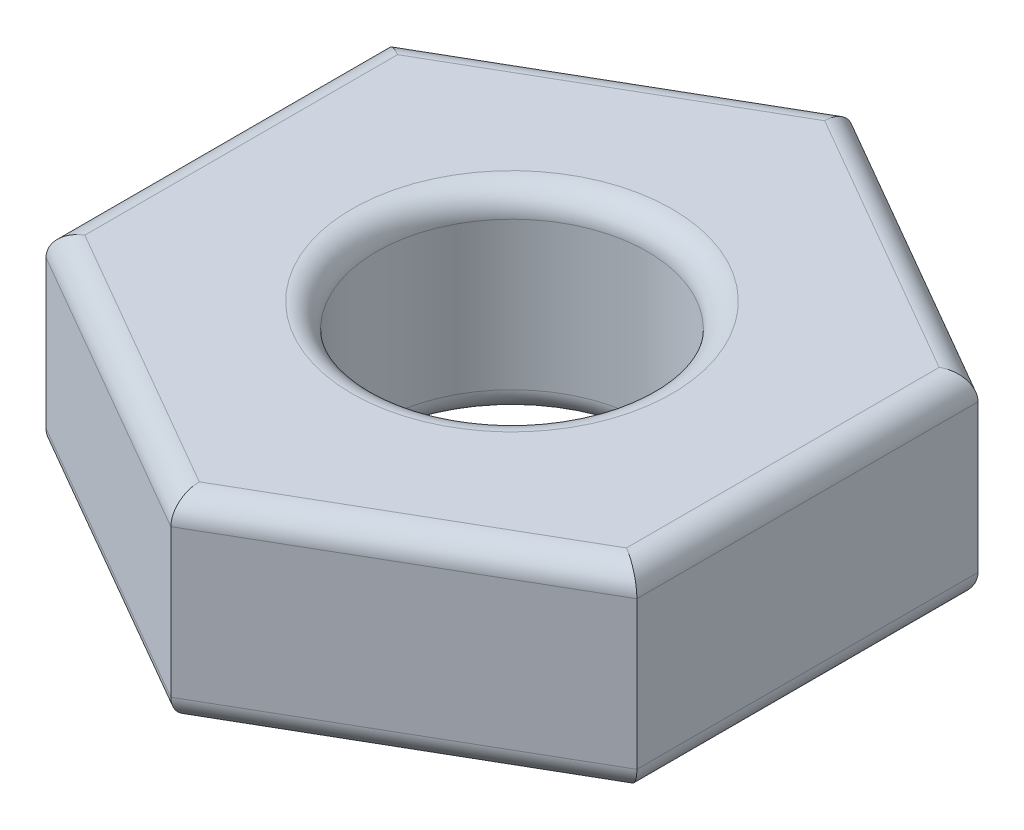
ISO-10303-21;
HEADER;
FILE_DESCRIPTION(('STEP AP214'),'2;1');
FILE_NAME('part.step','',(''),(''),'','','');
FILE_SCHEMA(('AUTOMOTIVE_DESIGN { 1 0 10303 214 1 1 1 1 }'));
ENDSEC;
DATA;
#1=APPLICATION_CONTEXT('core data for automotive mechanical design processes');
#2=APPLICATION_PROTOCOL_DEFINITION('international standard','automotive_design',2000,#1);
#3=PRODUCT_CONTEXT('',#1,'mechanical');
#4=PRODUCT('Part','Part','',(#3));
#5=PRODUCT_RELATED_PRODUCT_CATEGORY('part','',(#4));
#6=PRODUCT_DEFINITION_FORMATION('','',#4);
#7=PRODUCT_DEFINITION_CONTEXT('part definition',#1,'design');
#8=PRODUCT_DEFINITION('design','',#6,#7);
#9=PRODUCT_DEFINITION_SHAPE('','',#8);
#10=(LENGTH_UNIT() NAMED_UNIT(*) SI_UNIT(.MILLI.,.METRE.));
#11=(NAMED_UNIT(*) PLANE_ANGLE_UNIT() SI_UNIT($,.RADIAN.));
#12=(NAMED_UNIT(*) SI_UNIT($,.STERADIAN.) SOLID_ANGLE_UNIT());
#13=UNCERTAINTY_MEASURE_WITH_UNIT(LENGTH_MEASURE(1.E-05),#10,'distance_accuracy_value','');
#14=(GEOMETRIC_REPRESENTATION_CONTEXT(3) GLOBAL_UNCERTAINTY_ASSIGNED_CONTEXT((#13)) GLOBAL_UNIT_ASSIGNED_CONTEXT((#10,
#11,#12)) REPRESENTATION_CONTEXT('',''));
#15=CARTESIAN_POINT('',(0.,0.,0.));
#16=DIRECTION('',(0.,0.,1.));
#17=DIRECTION('',(1.,0.,0.));
#18=AXIS2_PLACEMENT_3D('',#15,#16,#17);
#19=CARTESIAN_POINT('',(2.4,1.6,1.3856406460551));
#20=DIRECTION('',(-1.,0.,0.));
#21=DIRECTION('',(0.,0.,1.));
#22=AXIS2_PLACEMENT_3D('',#19,#20,#21);
#23=PLANE('',#22);
#24=DIRECTION('',(0.,-1.,0.));
#25=VECTOR('',#24,1.);
#26=CARTESIAN_POINT('',(2.4,1.6,1.3856406460551));
#27=LINE('',#26,#25);
#28=CARTESIAN_POINT('',(2.4,1.4,1.3856406460551));
#29=VERTEX_POINT('',#28);
#30=CARTESIAN_POINT('',(2.4,0.2,1.3856406460551));
#31=VERTEX_POINT('',#30);
#32=EDGE_CURVE('E233',#29,#31,#27,.T.);
#33=ORIENTED_EDGE('',*,*,#32,.T.);
#34=DIRECTION('',(0.,0.,-1.));
#35=VECTOR('',#34,1.);
#36=CARTESIAN_POINT('',(2.4,0.2,1.3856406460551));
#37=LINE('',#36,#35);
#38=CARTESIAN_POINT('',(2.4,0.2,-1.3856406460551));
#39=VERTEX_POINT('',#38);
#40=EDGE_CURVE('E199',#31,#39,#37,.T.);
#41=ORIENTED_EDGE('',*,*,#40,.T.);
#42=DIRECTION('',(0.,-1.,0.));
#43=VECTOR('',#42,1.);
#44=CARTESIAN_POINT('',(2.4,1.6,-1.3856406460551));
#45=LINE('',#44,#43);
#46=CARTESIAN_POINT('',(2.4,1.4,-1.3856406460551));
#47=VERTEX_POINT('',#46);
#48=EDGE_CURVE('E149',#47,#39,#45,.T.);
#49=ORIENTED_EDGE('',*,*,#48,.F.);
#50=DIRECTION('',(0.,0.,-1.));
#51=VECTOR('',#50,1.);
#52=CARTESIAN_POINT('',(2.4,1.4,1.3856406460551));
#53=LINE('',#52,#51);
#54=EDGE_CURVE('E197',#47,#29,#53,.F.);
#55=ORIENTED_EDGE('',*,*,#54,.T.);
#56=EDGE_LOOP('',(#33,#41,#49,#55));
#57=FACE_BOUND('',#56,.T.);
#58=ADVANCED_FACE('F37',(#57),#23,.F.);
#59=CARTESIAN_POINT('',(2.4,1.6,-1.3856406460551));
#60=DIRECTION('',(-0.5,0.,0.866025403784439));
#61=DIRECTION('',(0.866025403784439,0.,0.5));
#62=AXIS2_PLACEMENT_3D('',#59,#60,#61);
#63=PLANE('',#62);
#64=ORIENTED_EDGE('',*,*,#48,.T.);
#65=DIRECTION('',(-0.866025403784439,0.,-0.5));
#66=VECTOR('',#65,1.);
#67=CARTESIAN_POINT('',(2.4,0.2,-1.3856406460551));
#68=LINE('',#67,#66);
#69=CARTESIAN_POINT('',(0.,0.2,-2.7712812921102));
#70=VERTEX_POINT('',#69);
#71=EDGE_CURVE('E148',#39,#70,#68,.T.);
#72=ORIENTED_EDGE('',*,*,#71,.T.);
#73=DIRECTION('',(0.,-1.,0.));
#74=VECTOR('',#73,1.);
#75=CARTESIAN_POINT('',(0.,1.6,-2.7712812921102));
#76=LINE('',#75,#74);
#77=CARTESIAN_POINT('',(0.,1.4,-2.7712812921102));
#78=VERTEX_POINT('',#77);
#79=EDGE_CURVE('E130',#78,#70,#76,.T.);
#80=ORIENTED_EDGE('',*,*,#79,.F.);
#81=DIRECTION('',(-0.866025403784439,0.,-0.5));
#82=VECTOR('',#81,1.);
#83=CARTESIAN_POINT('',(2.4,1.4,-1.3856406460551));
#84=LINE('',#83,#82);
#85=EDGE_CURVE('E145',#78,#47,#84,.F.);
#86=ORIENTED_EDGE('',*,*,#85,.T.);
#87=EDGE_LOOP('',(#64,#72,#80,#86));
#88=FACE_BOUND('',#87,.T.);
#89=ADVANCED_FACE('F143',(#88),#63,.F.);
#90=CARTESIAN_POINT('',(0.,1.6,-2.7712812921102));
#91=DIRECTION('',(0.5,0.,0.866025403784438));
#92=DIRECTION('',(0.866025403784439,0.,-0.5));
#93=AXIS2_PLACEMENT_3D('',#90,#91,#92);
#94=PLANE('',#93);
#95=ORIENTED_EDGE('',*,*,#79,.T.);
#96=DIRECTION('',(-0.866025403784439,0.,0.5));
#97=VECTOR('',#96,1.);
#98=CARTESIAN_POINT('',(0.,0.2,-2.7712812921102));
#99=LINE('',#98,#97);
#100=CARTESIAN_POINT('',(-2.4,0.2,-1.3856406460551));
#101=VERTEX_POINT('',#100);
#102=EDGE_CURVE('E137',#70,#101,#99,.T.);
#103=ORIENTED_EDGE('',*,*,#102,.T.);
#104=DIRECTION('',(0.,-1.,0.));
#105=VECTOR('',#104,1.);
#106=CARTESIAN_POINT('',(-2.4,1.6,-1.3856406460551));
#107=LINE('',#106,#105);
#108=CARTESIAN_POINT('',(-2.4,1.4,-1.3856406460551));
#109=VERTEX_POINT('',#108);
#110=EDGE_CURVE('E132',#109,#101,#107,.T.);
#111=ORIENTED_EDGE('',*,*,#110,.F.);
#112=DIRECTION('',(-0.866025403784439,0.,0.5));
#113=VECTOR('',#112,1.);
#114=CARTESIAN_POINT('',(0.,1.4,-2.7712812921102));
#115=LINE('',#114,#113);
#116=EDGE_CURVE('E127',#109,#78,#115,.F.);
#117=ORIENTED_EDGE('',*,*,#116,.T.);
#118=EDGE_LOOP('',(#95,#103,#111,#117));
#119=FACE_BOUND('',#118,.T.);
#120=ADVANCED_FACE('F129',(#119),#94,.F.);
#121=CARTESIAN_POINT('',(-2.4,1.6,-1.3856406460551));
#122=DIRECTION('',(1.,0.,0.));
#123=DIRECTION('',(0.,0.,-1.));
#124=AXIS2_PLACEMENT_3D('',#121,#122,#123);
#125=PLANE('',#124);
#126=ORIENTED_EDGE('',*,*,#110,.T.);
#127=DIRECTION('',(0.,0.,1.));
#128=VECTOR('',#127,1.);
#129=CARTESIAN_POINT('',(-2.4,0.2,-1.3856406460551));
#130=LINE('',#129,#128);
#131=CARTESIAN_POINT('',(-2.4,0.2,1.3856406460551));
#132=VERTEX_POINT('',#131);
#133=EDGE_CURVE('E186',#101,#132,#130,.T.);
#134=ORIENTED_EDGE('',*,*,#133,.T.);
#135=DIRECTION('',(0.,-1.,0.));
#136=VECTOR('',#135,1.);
#137=CARTESIAN_POINT('',(-2.4,1.6,1.3856406460551));
#138=LINE('',#137,#136);
#139=CARTESIAN_POINT('',(-2.4,1.4,1.3856406460551));
#140=VERTEX_POINT('',#139);
#141=EDGE_CURVE('E251',#140,#132,#138,.T.);
#142=ORIENTED_EDGE('',*,*,#141,.F.);
#143=DIRECTION('',(0.,0.,1.));
#144=VECTOR('',#143,1.);
#145=CARTESIAN_POINT('',(-2.4,1.4,-1.3856406460551));
#146=LINE('',#145,#144);
#147=EDGE_CURVE('E184',#140,#109,#146,.F.);
#148=ORIENTED_EDGE('',*,*,#147,.T.);
#149=EDGE_LOOP('',(#126,#134,#142,#148));
#150=FACE_BOUND('',#149,.T.);
#151=ADVANCED_FACE('F248',(#150),#125,.F.);
#152=CARTESIAN_POINT('',(-2.4,1.6,1.3856406460551));
#153=DIRECTION('',(0.5,0.,-0.866025403784439));
#154=DIRECTION('',(-0.866025403784439,0.,-0.5));
#155=AXIS2_PLACEMENT_3D('',#152,#153,#154);
#156=PLANE('',#155);
#157=ORIENTED_EDGE('',*,*,#141,.T.);
#158=DIRECTION('',(0.866025403784439,0.,0.5));
#159=VECTOR('',#158,1.);
#160=CARTESIAN_POINT('',(-2.4,0.2,1.3856406460551));
#161=LINE('',#160,#159);
#162=CARTESIAN_POINT('',(0.,0.2,2.7712812921102));
#163=VERTEX_POINT('',#162);
#164=EDGE_CURVE('E190',#132,#163,#161,.T.);
#165=ORIENTED_EDGE('',*,*,#164,.T.);
#166=DIRECTION('',(0.,-1.,0.));
#167=VECTOR('',#166,1.);
#168=CARTESIAN_POINT('',(0.,1.6,2.7712812921102));
#169=LINE('',#168,#167);
#170=CARTESIAN_POINT('',(0.,1.4,2.7712812921102));
#171=VERTEX_POINT('',#170);
#172=EDGE_CURVE('E254',#171,#163,#169,.T.);
#173=ORIENTED_EDGE('',*,*,#172,.F.);
#174=DIRECTION('',(0.866025403784439,0.,0.5));
#175=VECTOR('',#174,1.);
#176=CARTESIAN_POINT('',(-2.4,1.4,1.3856406460551));
#177=LINE('',#176,#175);
#178=EDGE_CURVE('E188',#171,#140,#177,.F.);
#179=ORIENTED_EDGE('',*,*,#178,.T.);
#180=EDGE_LOOP('',(#157,#165,#173,#179));
#181=FACE_BOUND('',#180,.T.);
#182=ADVANCED_FACE('F293',(#181),#156,.F.);
#183=CARTESIAN_POINT('',(0.,1.6,2.7712812921102));
#184=DIRECTION('',(-0.5,0.,-0.866025403784438));
#185=DIRECTION('',(-0.866025403784439,0.,0.5));
#186=AXIS2_PLACEMENT_3D('',#183,#184,#185);
#187=PLANE('',#186);
#188=ORIENTED_EDGE('',*,*,#172,.T.);
#189=DIRECTION('',(0.866025403784439,0.,-0.5));
#190=VECTOR('',#189,1.);
#191=CARTESIAN_POINT('',(0.,0.2,2.7712812921102));
#192=LINE('',#191,#190);
#193=EDGE_CURVE('E195',#163,#31,#192,.T.);
#194=ORIENTED_EDGE('',*,*,#193,.T.);
#195=ORIENTED_EDGE('',*,*,#32,.F.);
#196=DIRECTION('',(0.866025403784439,0.,-0.5));
#197=VECTOR('',#196,1.);
#198=CARTESIAN_POINT('',(0.,1.4,2.7712812921102));
#199=LINE('',#198,#197);
#200=EDGE_CURVE('E192',#29,#171,#199,.F.);
#201=ORIENTED_EDGE('',*,*,#200,.T.);
#202=EDGE_LOOP('',(#188,#194,#195,#201));
#203=FACE_BOUND('',#202,.T.);
#204=ADVANCED_FACE('F294',(#203),#187,.F.);
#205=CARTESIAN_POINT('',(0.,1.6,0.));
#206=DIRECTION('',(0.,1.,0.));
#207=DIRECTION('',(0.,0.,1.));
#208=AXIS2_PLACEMENT_3D('',#205,#206,#207);
#209=PLANE('',#208);
#210=DIRECTION('',(0.866025403784439,0.,0.5));
#211=VECTOR('',#210,1.);
#212=CARTESIAN_POINT('',(0.0999999999999996,1.6,2.59807621135332));
#213=LINE('',#212,#211);
#214=CARTESIAN_POINT('',(-2.2,1.6,1.27017059221718));
#215=VERTEX_POINT('',#214);
#216=CARTESIAN_POINT('',(0.,1.6,2.54034118443435));
#217=VERTEX_POINT('',#216);
#218=EDGE_CURVE('E46',#215,#217,#213,.T.);
#219=ORIENTED_EDGE('',*,*,#218,.T.);
#220=DIRECTION('',(0.866025403784439,0.,-0.5));
#221=VECTOR('',#220,1.);
#222=CARTESIAN_POINT('',(2.3,1.6,1.21243556529821));
#223=LINE('',#222,#221);
#224=CARTESIAN_POINT('',(2.2,1.6,1.27017059221718));
#225=VERTEX_POINT('',#224);
#226=EDGE_CURVE('E11',#217,#225,#223,.T.);
#227=ORIENTED_EDGE('',*,*,#226,.T.);
#228=DIRECTION('',(0.,0.,-1.));
#229=VECTOR('',#228,1.);
#230=CARTESIAN_POINT('',(2.2,1.6,-1.3856406460551));
#231=LINE('',#230,#229);
#232=CARTESIAN_POINT('',(2.2,1.6,-1.27017059221718));
#233=VERTEX_POINT('',#232);
#234=EDGE_CURVE('E210',#225,#233,#231,.T.);
#235=ORIENTED_EDGE('',*,*,#234,.T.);
#236=DIRECTION('',(-0.866025403784439,0.,-0.5));
#237=VECTOR('',#236,1.);
#238=CARTESIAN_POINT('',(-0.0999999999999996,1.6,-2.59807621135331));
#239=LINE('',#238,#237);
#240=CARTESIAN_POINT('',(0.,1.6,-2.54034118443435));
#241=VERTEX_POINT('',#240);
#242=EDGE_CURVE('E212',#233,#241,#239,.T.);
#243=ORIENTED_EDGE('',*,*,#242,.T.);
#244=DIRECTION('',(-0.866025403784439,0.,0.5));
#245=VECTOR('',#244,1.);
#246=CARTESIAN_POINT('',(-2.3,1.6,-1.21243556529821));
#247=LINE('',#246,#245);
#248=CARTESIAN_POINT('',(-2.2,1.6,-1.27017059221718));
#249=VERTEX_POINT('',#248);
#250=EDGE_CURVE('E155',#241,#249,#247,.T.);
#251=ORIENTED_EDGE('',*,*,#250,.T.);
#252=DIRECTION('',(0.,0.,1.));
#253=VECTOR('',#252,1.);
#254=CARTESIAN_POINT('',(-2.2,1.6,1.3856406460551));
#255=LINE('',#254,#253);
#256=EDGE_CURVE('E57',#249,#215,#255,.T.);
#257=ORIENTED_EDGE('',*,*,#256,.T.);
#258=EDGE_LOOP('',(#219,#227,#235,#243,#251,#257));
#259=FACE_BOUND('',#258,.T.);
#260=CARTESIAN_POINT('',(0.,1.6,0.));
#261=DIRECTION('',(0.,1.,0.));
#262=DIRECTION('',(0.,0.,1.));
#263=AXIS2_PLACEMENT_3D('',#260,#261,#262);
#264=CIRCLE('',#263,1.3);
#265=CARTESIAN_POINT('',(0.,1.6,1.3));
#266=VERTEX_POINT('',#265);
#267=EDGE_CURVE('E207',#266,#266,#264,.F.);
#268=ORIENTED_EDGE('',*,*,#267,.T.);
#269=EDGE_LOOP('',(#268));
#270=FACE_BOUND('',#269,.T.);
#271=ADVANCED_FACE('F302',(#259,#270),#209,.T.);
#272=CARTESIAN_POINT('',(0.,0.,0.));
#273=DIRECTION('',(0.,1.,0.));
#274=DIRECTION('',(0.,0.,1.));
#275=AXIS2_PLACEMENT_3D('',#272,#273,#274);
#276=PLANE('',#275);
#277=DIRECTION('',(-0.866025403784439,0.,0.5));
#278=VECTOR('',#277,1.);
#279=CARTESIAN_POINT('',(-1.1,0.,-1.90525588832576));
#280=LINE('',#279,#278);
#281=CARTESIAN_POINT('',(-2.2,0.,-1.27017059221718));
#282=VERTEX_POINT('',#281);
#283=CARTESIAN_POINT('',(0.,0.,-2.54034118443435));
#284=VERTEX_POINT('',#283);
#285=EDGE_CURVE('E179',#282,#284,#280,.F.);
#286=ORIENTED_EDGE('',*,*,#285,.T.);
#287=DIRECTION('',(-0.866025403784439,0.,-0.5));
#288=VECTOR('',#287,1.);
#289=CARTESIAN_POINT('',(1.1,0.,-1.90525588832576));
#290=LINE('',#289,#288);
#291=CARTESIAN_POINT('',(2.2,0.,-1.27017059221718));
#292=VERTEX_POINT('',#291);
#293=EDGE_CURVE('E138',#284,#292,#290,.F.);
#294=ORIENTED_EDGE('',*,*,#293,.T.);
#295=DIRECTION('',(0.,0.,-1.));
#296=VECTOR('',#295,1.);
#297=CARTESIAN_POINT('',(2.2,0.,0.));
#298=LINE('',#297,#296);
#299=CARTESIAN_POINT('',(2.2,0.,1.27017059221718));
#300=VERTEX_POINT('',#299);
#301=EDGE_CURVE('E171',#292,#300,#298,.F.);
#302=ORIENTED_EDGE('',*,*,#301,.T.);
#303=DIRECTION('',(0.866025403784439,0.,-0.5));
#304=VECTOR('',#303,1.);
#305=CARTESIAN_POINT('',(1.1,0.,1.90525588832576));
#306=LINE('',#305,#304);
#307=CARTESIAN_POINT('',(0.,0.,2.54034118443435));
#308=VERTEX_POINT('',#307);
#309=EDGE_CURVE('E173',#300,#308,#306,.F.);
#310=ORIENTED_EDGE('',*,*,#309,.T.);
#311=DIRECTION('',(0.866025403784439,0.,0.5));
#312=VECTOR('',#311,1.);
#313=CARTESIAN_POINT('',(-1.1,0.,1.90525588832576));
#314=LINE('',#313,#312);
#315=CARTESIAN_POINT('',(-2.2,0.,1.27017059221718));
#316=VERTEX_POINT('',#315);
#317=EDGE_CURVE('E175',#308,#316,#314,.F.);
#318=ORIENTED_EDGE('',*,*,#317,.T.);
#319=DIRECTION('',(0.,0.,1.));
#320=VECTOR('',#319,1.);
#321=CARTESIAN_POINT('',(-2.2,0.,0.));
#322=LINE('',#321,#320);
#323=EDGE_CURVE('E177',#316,#282,#322,.F.);
#324=ORIENTED_EDGE('',*,*,#323,.T.);
#325=EDGE_LOOP('',(#286,#294,#302,#310,#318,#324));
#326=FACE_BOUND('',#325,.T.);
#327=CARTESIAN_POINT('',(0.,0.,0.));
#328=DIRECTION('',(0.,1.,0.));
#329=DIRECTION('',(0.,0.,1.));
#330=AXIS2_PLACEMENT_3D('',#327,#328,#329);
#331=CIRCLE('',#330,1.3);
#332=CARTESIAN_POINT('',(0.,0.,1.3));
#333=VERTEX_POINT('',#332);
#334=EDGE_CURVE('E165',#333,#333,#331,.T.);
#335=ORIENTED_EDGE('',*,*,#334,.T.);
#336=EDGE_LOOP('',(#335));
#337=FACE_BOUND('',#336,.T.);
#338=ADVANCED_FACE('F305',(#326,#337),#276,.F.);
#339=CARTESIAN_POINT('',(0.,-0.000999999999999916,0.));
#340=DIRECTION('',(0.,1.,0.));
#341=DIRECTION('',(0.,0.,1.));
#342=AXIS2_PLACEMENT_3D('',#339,#340,#341);
#343=CYLINDRICAL_SURFACE('',#342,1.1);
#344=CARTESIAN_POINT('',(0.,0.2,0.));
#345=DIRECTION('',(0.,1.,0.));
#346=DIRECTION('',(0.,0.,1.));
#347=AXIS2_PLACEMENT_3D('',#344,#345,#346);
#348=CIRCLE('',#347,1.1);
#349=CARTESIAN_POINT('',(0.,0.2,1.1));
#350=VERTEX_POINT('',#349);
#351=EDGE_CURVE('E204',#350,#350,#348,.F.);
#352=ORIENTED_EDGE('',*,*,#351,.T.);
#353=EDGE_LOOP('',(#352));
#354=FACE_BOUND('',#353,.T.);
#355=CARTESIAN_POINT('',(0.,1.4,0.));
#356=DIRECTION('',(0.,1.,0.));
#357=DIRECTION('',(0.,0.,1.));
#358=AXIS2_PLACEMENT_3D('',#355,#356,#357);
#359=CIRCLE('',#358,1.1);
#360=CARTESIAN_POINT('',(0.,1.4,1.1));
#361=VERTEX_POINT('',#360);
#362=EDGE_CURVE('E201',#361,#361,#359,.T.);
#363=ORIENTED_EDGE('',*,*,#362,.T.);
#364=EDGE_LOOP('',(#363));
#365=FACE_BOUND('',#364,.T.);
#366=ADVANCED_FACE('F313',(#354,#365),#343,.F.);
#367=CARTESIAN_POINT('',(-2.3,0.2,1.21243556529822));
#368=DIRECTION('',(0.866025403784439,0.,0.5));
#369=DIRECTION('',(0.5,0.,-0.866025403784439));
#370=AXIS2_PLACEMENT_3D('',#367,#368,#369);
#371=CYLINDRICAL_SURFACE('',#370,0.2);
#372=CARTESIAN_POINT('',(-2.2,0.2,1.27017059221718));
#373=DIRECTION('',(0.5,0.,0.866025403784439));
#374=DIRECTION('',(0.866025403784439,0.,-0.5));
#375=AXIS2_PLACEMENT_3D('',#372,#373,#374);
#376=ELLIPSE('',#375,0.23094010767585,0.2);
#377=EDGE_CURVE('E227',#316,#132,#376,.F.);
#378=ORIENTED_EDGE('',*,*,#377,.F.);
#379=ORIENTED_EDGE('',*,*,#317,.F.);
#380=CARTESIAN_POINT('',(0.,0.2,2.54034118443435));
#381=DIRECTION('',(1.,0.,0.));
#382=DIRECTION('',(0.,0.,-1.));
#383=AXIS2_PLACEMENT_3D('',#380,#381,#382);
#384=ELLIPSE('',#383,0.23094010767585,0.2);
#385=EDGE_CURVE('E230',#163,#308,#384,.T.);
#386=ORIENTED_EDGE('',*,*,#385,.F.);
#387=ORIENTED_EDGE('',*,*,#164,.F.);
#388=EDGE_LOOP('',(#378,#379,#386,#387));
#389=FACE_BOUND('',#388,.T.);
#390=ADVANCED_FACE('F290',(#389),#371,.T.);
#391=CARTESIAN_POINT('',(-0.100000000000001,0.2,2.59807621135332));
#392=DIRECTION('',(0.866025403784439,0.,-0.5));
#393=DIRECTION('',(-0.5,0.,-0.866025403784438));
#394=AXIS2_PLACEMENT_3D('',#391,#392,#393);
#395=CYLINDRICAL_SURFACE('',#394,0.2);
#396=ORIENTED_EDGE('',*,*,#385,.T.);
#397=ORIENTED_EDGE('',*,*,#309,.F.);
#398=CARTESIAN_POINT('',(2.2,0.2,1.27017059221717));
#399=DIRECTION('',(0.5,0.,-0.866025403784439));
#400=DIRECTION('',(-0.866025403784439,0.,-0.5));
#401=AXIS2_PLACEMENT_3D('',#398,#399,#400);
#402=ELLIPSE('',#401,0.23094010767585,0.2);
#403=EDGE_CURVE('E224',#31,#300,#402,.T.);
#404=ORIENTED_EDGE('',*,*,#403,.F.);
#405=ORIENTED_EDGE('',*,*,#193,.F.);
#406=EDGE_LOOP('',(#396,#397,#404,#405));
#407=FACE_BOUND('',#406,.T.);
#408=ADVANCED_FACE('F270',(#407),#395,.T.);
#409=CARTESIAN_POINT('',(-2.2,0.2,-1.3856406460551));
#410=DIRECTION('',(0.,0.,1.));
#411=DIRECTION('',(1.,0.,0.));
#412=AXIS2_PLACEMENT_3D('',#409,#410,#411);
#413=CYLINDRICAL_SURFACE('',#412,0.2);
#414=ORIENTED_EDGE('',*,*,#377,.T.);
#415=ORIENTED_EDGE('',*,*,#133,.F.);
#416=CARTESIAN_POINT('',(-2.2,0.2,-1.27017059221717));
#417=DIRECTION('',(-0.5,0.,0.866025403784439));
#418=DIRECTION('',(0.866025403784439,0.,0.5));
#419=AXIS2_PLACEMENT_3D('',#416,#417,#418);
#420=ELLIPSE('',#419,0.23094010767585,0.2);
#421=EDGE_CURVE('E221',#282,#101,#420,.F.);
#422=ORIENTED_EDGE('',*,*,#421,.F.);
#423=ORIENTED_EDGE('',*,*,#323,.F.);
#424=EDGE_LOOP('',(#414,#415,#422,#423));
#425=FACE_BOUND('',#424,.T.);
#426=ADVANCED_FACE('F286',(#425),#413,.T.);
#427=CARTESIAN_POINT('',(2.2,0.2,1.3856406460551));
#428=DIRECTION('',(0.,0.,-1.));
#429=DIRECTION('',(-1.,0.,0.));
#430=AXIS2_PLACEMENT_3D('',#427,#428,#429);
#431=CYLINDRICAL_SURFACE('',#430,0.2);
#432=ORIENTED_EDGE('',*,*,#403,.T.);
#433=ORIENTED_EDGE('',*,*,#301,.F.);
#434=CARTESIAN_POINT('',(2.2,0.2,-1.27017059221718));
#435=DIRECTION('',(-0.5,0.,-0.866025403784439));
#436=DIRECTION('',(0.866025403784439,0.,-0.5));
#437=AXIS2_PLACEMENT_3D('',#434,#435,#436);
#438=ELLIPSE('',#437,0.23094010767585,0.2);
#439=EDGE_CURVE('E219',#39,#292,#438,.T.);
#440=ORIENTED_EDGE('',*,*,#439,.F.);
#441=ORIENTED_EDGE('',*,*,#40,.F.);
#442=EDGE_LOOP('',(#432,#433,#440,#441));
#443=FACE_BOUND('',#442,.T.);
#444=ADVANCED_FACE('F274',(#443),#431,.T.);
#445=CARTESIAN_POINT('',(0.100000000000001,0.2,-2.59807621135331));
#446=DIRECTION('',(-0.866025403784439,0.,0.5));
#447=DIRECTION('',(0.5,0.,0.866025403784438));
#448=AXIS2_PLACEMENT_3D('',#445,#446,#447);
#449=CYLINDRICAL_SURFACE('',#448,0.2);
#450=ORIENTED_EDGE('',*,*,#421,.T.);
#451=ORIENTED_EDGE('',*,*,#102,.F.);
#452=CARTESIAN_POINT('',(0.,0.2,-2.54034118443435));
#453=DIRECTION('',(-1.,0.,0.));
#454=DIRECTION('',(0.,0.,1.));
#455=AXIS2_PLACEMENT_3D('',#452,#453,#454);
#456=ELLIPSE('',#455,0.23094010767585,0.2);
#457=EDGE_CURVE('E217',#284,#70,#456,.F.);
#458=ORIENTED_EDGE('',*,*,#457,.F.);
#459=ORIENTED_EDGE('',*,*,#285,.F.);
#460=EDGE_LOOP('',(#450,#451,#458,#459));
#461=FACE_BOUND('',#460,.T.);
#462=ADVANCED_FACE('F282',(#461),#449,.T.);
#463=CARTESIAN_POINT('',(2.3,0.2,-1.21243556529821));
#464=DIRECTION('',(-0.866025403784439,0.,-0.5));
#465=DIRECTION('',(-0.5,0.,0.866025403784439));
#466=AXIS2_PLACEMENT_3D('',#463,#464,#465);
#467=CYLINDRICAL_SURFACE('',#466,0.2);
#468=ORIENTED_EDGE('',*,*,#439,.T.);
#469=ORIENTED_EDGE('',*,*,#293,.F.);
#470=ORIENTED_EDGE('',*,*,#457,.T.);
#471=ORIENTED_EDGE('',*,*,#71,.F.);
#472=EDGE_LOOP('',(#468,#469,#470,#471));
#473=FACE_BOUND('',#472,.T.);
#474=ADVANCED_FACE('F277',(#473),#467,.T.);
#475=CARTESIAN_POINT('',(0.,0.2,0.));
#476=DIRECTION('',(0.,1.,0.));
#477=DIRECTION('',(0.,0.,1.));
#478=AXIS2_PLACEMENT_3D('',#475,#476,#477);
#479=TOROIDAL_SURFACE('',#478,1.3,0.2);
#480=ORIENTED_EDGE('',*,*,#334,.F.);
#481=EDGE_LOOP('',(#480));
#482=FACE_BOUND('',#481,.T.);
#483=ORIENTED_EDGE('',*,*,#351,.F.);
#484=EDGE_LOOP('',(#483));
#485=FACE_BOUND('',#484,.T.);
#486=ADVANCED_FACE('F334',(#482,#485),#479,.T.);
#487=CARTESIAN_POINT('',(-1.1,1.4,-1.90525588832576));
#488=DIRECTION('',(0.866025403784439,0.,-0.5));
#489=DIRECTION('',(-0.5,0.,-0.866025403784438));
#490=AXIS2_PLACEMENT_3D('',#487,#488,#489);
#491=CYLINDRICAL_SURFACE('',#490,0.2);
#492=CARTESIAN_POINT('',(0.,1.4,-2.54034118443435));
#493=DIRECTION('',(1.,0.,0.));
#494=DIRECTION('',(0.,0.,1.));
#495=AXIS2_PLACEMENT_3D('',#492,#493,#494);
#496=ELLIPSE('',#495,0.23094010767585,0.2);
#497=EDGE_CURVE('E153',#78,#241,#496,.T.);
#498=ORIENTED_EDGE('',*,*,#497,.F.);
#499=ORIENTED_EDGE('',*,*,#116,.F.);
#500=CARTESIAN_POINT('',(-2.2,1.4,-1.27017059221718));
#501=DIRECTION('',(0.5,0.,-0.866025403784439));
#502=DIRECTION('',(0.866025403784439,0.,0.5));
#503=AXIS2_PLACEMENT_3D('',#500,#501,#502);
#504=ELLIPSE('',#503,0.23094010767585,0.2);
#505=EDGE_CURVE('E41',#249,#109,#504,.F.);
#506=ORIENTED_EDGE('',*,*,#505,.F.);
#507=ORIENTED_EDGE('',*,*,#250,.F.);
#508=EDGE_LOOP('',(#498,#499,#506,#507));
#509=FACE_BOUND('',#508,.T.);
#510=ADVANCED_FACE('F154',(#509),#491,.T.);
#511=CARTESIAN_POINT('',(-2.2,1.4,0.));
#512=DIRECTION('',(0.,0.,-1.));
#513=DIRECTION('',(-1.,0.,0.));
#514=AXIS2_PLACEMENT_3D('',#511,#512,#513);
#515=CYLINDRICAL_SURFACE('',#514,0.2);
#516=ORIENTED_EDGE('',*,*,#505,.T.);
#517=ORIENTED_EDGE('',*,*,#147,.F.);
#518=CARTESIAN_POINT('',(-2.2,1.4,1.27017059221718));
#519=DIRECTION('',(-0.5,0.,-0.866025403784439));
#520=DIRECTION('',(0.866025403784439,0.,-0.5));
#521=AXIS2_PLACEMENT_3D('',#518,#519,#520);
#522=ELLIPSE('',#521,0.23094010767585,0.2);
#523=EDGE_CURVE('E158',#215,#140,#522,.F.);
#524=ORIENTED_EDGE('',*,*,#523,.F.);
#525=ORIENTED_EDGE('',*,*,#256,.F.);
#526=EDGE_LOOP('',(#516,#517,#524,#525));
#527=FACE_BOUND('',#526,.T.);
#528=ADVANCED_FACE('F245',(#527),#515,.T.);
#529=CARTESIAN_POINT('',(1.1,1.4,-1.90525588832576));
#530=DIRECTION('',(0.866025403784439,0.,0.5));
#531=DIRECTION('',(0.5,0.,-0.866025403784439));
#532=AXIS2_PLACEMENT_3D('',#529,#530,#531);
#533=CYLINDRICAL_SURFACE('',#532,0.2);
#534=ORIENTED_EDGE('',*,*,#497,.T.);
#535=ORIENTED_EDGE('',*,*,#242,.F.);
#536=CARTESIAN_POINT('',(2.2,1.4,-1.27017059221718));
#537=DIRECTION('',(0.5,0.,0.866025403784439));
#538=DIRECTION('',(-0.866025403784439,0.,0.5));
#539=AXIS2_PLACEMENT_3D('',#536,#537,#538);
#540=ELLIPSE('',#539,0.23094010767585,0.2);
#541=EDGE_CURVE('E162',#47,#233,#540,.T.);
#542=ORIENTED_EDGE('',*,*,#541,.F.);
#543=ORIENTED_EDGE('',*,*,#85,.F.);
#544=EDGE_LOOP('',(#534,#535,#542,#543));
#545=FACE_BOUND('',#544,.T.);
#546=ADVANCED_FACE('F160',(#545),#533,.T.);
#547=CARTESIAN_POINT('',(-1.1,1.4,1.90525588832576));
#548=DIRECTION('',(-0.866025403784439,0.,-0.5));
#549=DIRECTION('',(-0.5,0.,0.866025403784439));
#550=AXIS2_PLACEMENT_3D('',#547,#548,#549);
#551=CYLINDRICAL_SURFACE('',#550,0.2);
#552=ORIENTED_EDGE('',*,*,#523,.T.);
#553=ORIENTED_EDGE('',*,*,#178,.F.);
#554=CARTESIAN_POINT('',(0.,1.4,2.54034118443435));
#555=DIRECTION('',(-1.,0.,0.));
#556=DIRECTION('',(0.,0.,-1.));
#557=AXIS2_PLACEMENT_3D('',#554,#555,#556);
#558=ELLIPSE('',#557,0.23094010767585,0.2);
#559=EDGE_CURVE('E236',#217,#171,#558,.F.);
#560=ORIENTED_EDGE('',*,*,#559,.F.);
#561=ORIENTED_EDGE('',*,*,#218,.F.);
#562=EDGE_LOOP('',(#552,#553,#560,#561));
#563=FACE_BOUND('',#562,.T.);
#564=ADVANCED_FACE('F242',(#563),#551,.T.);
#565=CARTESIAN_POINT('',(2.2,1.4,0.));
#566=DIRECTION('',(0.,0.,1.));
#567=DIRECTION('',(1.,0.,0.));
#568=AXIS2_PLACEMENT_3D('',#565,#566,#567);
#569=CYLINDRICAL_SURFACE('',#568,0.2);
#570=ORIENTED_EDGE('',*,*,#541,.T.);
#571=ORIENTED_EDGE('',*,*,#234,.F.);
#572=CARTESIAN_POINT('',(2.2,1.4,1.27017059221717));
#573=DIRECTION('',(-0.5,0.,0.866025403784439));
#574=DIRECTION('',(0.866025403784439,0.,0.5));
#575=AXIS2_PLACEMENT_3D('',#572,#573,#574);
#576=ELLIPSE('',#575,0.23094010767585,0.2);
#577=EDGE_CURVE('E234',#29,#225,#576,.T.);
#578=ORIENTED_EDGE('',*,*,#577,.F.);
#579=ORIENTED_EDGE('',*,*,#54,.F.);
#580=EDGE_LOOP('',(#570,#571,#578,#579));
#581=FACE_BOUND('',#580,.T.);
#582=ADVANCED_FACE('F301',(#581),#569,.T.);
#583=CARTESIAN_POINT('',(1.1,1.4,1.90525588832576));
#584=DIRECTION('',(-0.866025403784439,0.,0.5));
#585=DIRECTION('',(0.5,0.,0.866025403784438));
#586=AXIS2_PLACEMENT_3D('',#583,#584,#585);
#587=CYLINDRICAL_SURFACE('',#586,0.2);
#588=ORIENTED_EDGE('',*,*,#559,.T.);
#589=ORIENTED_EDGE('',*,*,#200,.F.);
#590=ORIENTED_EDGE('',*,*,#577,.T.);
#591=ORIENTED_EDGE('',*,*,#226,.F.);
#592=EDGE_LOOP('',(#588,#589,#590,#591));
#593=FACE_BOUND('',#592,.T.);
#594=ADVANCED_FACE('F297',(#593),#587,.T.);
#595=CARTESIAN_POINT('',(0.,1.4,0.));
#596=DIRECTION('',(0.,1.,0.));
#597=DIRECTION('',(0.,0.,1.));
#598=AXIS2_PLACEMENT_3D('',#595,#596,#597);
#599=TOROIDAL_SURFACE('',#598,1.3,0.2);
#600=ORIENTED_EDGE('',*,*,#267,.F.);
#601=EDGE_LOOP('',(#600));
#602=FACE_BOUND('',#601,.T.);
#603=ORIENTED_EDGE('',*,*,#362,.F.);
#604=EDGE_LOOP('',(#603));
#605=FACE_BOUND('',#604,.T.);
#606=ADVANCED_FACE('F39',(#602,#605),#599,.T.);
#607=CLOSED_SHELL('',(#58,#89,#120,#151,#182,#204,#271,#338,#366,#390,#408,#426,#444,#462,#474,
#486,#510,#528,#546,#564,#582,#594,#606));
#608=MANIFOLD_SOLID_BREP('B2',#607);
#609=ADVANCED_BREP_SHAPE_REPRESENTATION('',(#18,#608),#14);
#610=SHAPE_DEFINITION_REPRESENTATION(#9,#609);
ENDSEC;
END-ISO-10303-21;
